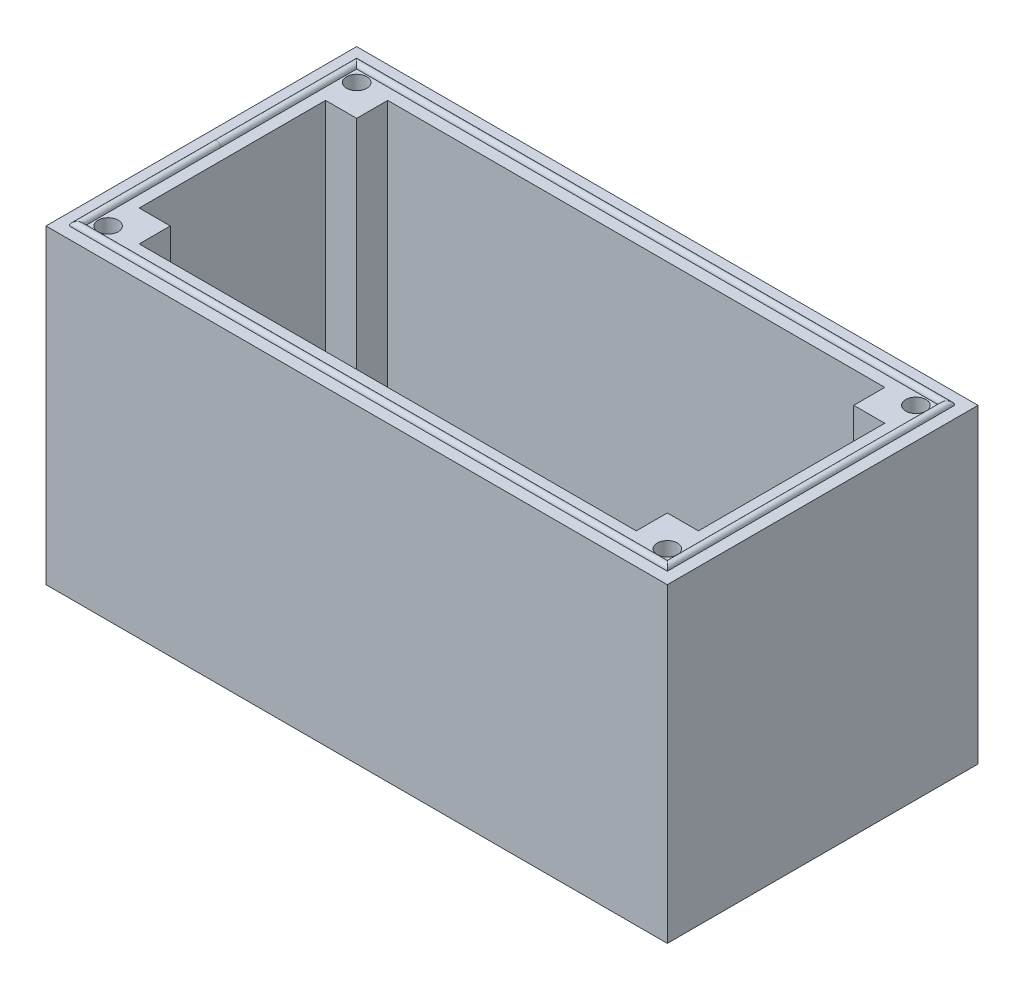
ISO-10303-21;
HEADER;
FILE_DESCRIPTION(('STEP AP214'),'2;1');
FILE_NAME('part.step','',(''),(''),'','','');
FILE_SCHEMA(('AUTOMOTIVE_DESIGN { 1 0 10303 214 1 1 1 1 }'));
ENDSEC;
DATA;
#1=APPLICATION_CONTEXT('core data for automotive mechanical design processes');
#2=APPLICATION_PROTOCOL_DEFINITION('international standard','automotive_design',2000,#1);
#3=PRODUCT_CONTEXT('',#1,'mechanical');
#4=PRODUCT('Part','Part','',(#3));
#5=PRODUCT_RELATED_PRODUCT_CATEGORY('part','',(#4));
#6=PRODUCT_DEFINITION_FORMATION('','',#4);
#7=PRODUCT_DEFINITION_CONTEXT('part definition',#1,'design');
#8=PRODUCT_DEFINITION('design','',#6,#7);
#9=PRODUCT_DEFINITION_SHAPE('','',#8);
#10=(LENGTH_UNIT() NAMED_UNIT(*) SI_UNIT(.MILLI.,.METRE.));
#11=(NAMED_UNIT(*) PLANE_ANGLE_UNIT() SI_UNIT($,.RADIAN.));
#12=(NAMED_UNIT(*) SI_UNIT($,.STERADIAN.) SOLID_ANGLE_UNIT());
#13=UNCERTAINTY_MEASURE_WITH_UNIT(LENGTH_MEASURE(1.E-05),#10,'distance_accuracy_value','');
#14=(GEOMETRIC_REPRESENTATION_CONTEXT(3) GLOBAL_UNCERTAINTY_ASSIGNED_CONTEXT((#13)) GLOBAL_UNIT_ASSIGNED_CONTEXT((#10,
#11,#12)) REPRESENTATION_CONTEXT('',''));
#15=CARTESIAN_POINT('',(0.,0.,0.));
#16=DIRECTION('',(0.,0.,1.));
#17=DIRECTION('',(1.,0.,0.));
#18=AXIS2_PLACEMENT_3D('',#15,#16,#17);
#19=CARTESIAN_POINT('',(40.,0.,-20.));
#20=DIRECTION('',(0.,-1.,0.));
#21=DIRECTION('',(0.,0.,-1.));
#22=AXIS2_PLACEMENT_3D('',#19,#20,#21);
#23=PLANE('',#22);
#24=CARTESIAN_POINT('',(2.,0.,-18.));
#25=DIRECTION('',(0.,-1.,0.));
#26=DIRECTION('',(0.,0.,-1.));
#27=AXIS2_PLACEMENT_3D('',#24,#25,#26);
#28=CIRCLE('',#27,0.675);
#29=CARTESIAN_POINT('',(2.,0.,-18.675));
#30=VERTEX_POINT('',#29);
#31=EDGE_CURVE('E852',#30,#30,#28,.T.);
#32=ORIENTED_EDGE('',*,*,#31,.F.);
#33=EDGE_LOOP('',(#32));
#34=FACE_BOUND('',#33,.T.);
#35=CARTESIAN_POINT('',(2.,0.,-2.));
#36=DIRECTION('',(0.,-1.,0.));
#37=DIRECTION('',(0.,0.,-1.));
#38=AXIS2_PLACEMENT_3D('',#35,#36,#37);
#39=CIRCLE('',#38,0.675);
#40=CARTESIAN_POINT('',(2.,0.,-2.675));
#41=VERTEX_POINT('',#40);
#42=EDGE_CURVE('E504',#41,#41,#39,.T.);
#43=ORIENTED_EDGE('',*,*,#42,.F.);
#44=EDGE_LOOP('',(#43));
#45=FACE_BOUND('',#44,.T.);
#46=CARTESIAN_POINT('',(38.,0.,-2.));
#47=DIRECTION('',(0.,-1.,0.));
#48=DIRECTION('',(0.,0.,-1.));
#49=AXIS2_PLACEMENT_3D('',#46,#47,#48);
#50=CIRCLE('',#49,0.675000000000002);
#51=CARTESIAN_POINT('',(38.,0.,-2.675));
#52=VERTEX_POINT('',#51);
#53=EDGE_CURVE('E495',#52,#52,#50,.T.);
#54=ORIENTED_EDGE('',*,*,#53,.F.);
#55=EDGE_LOOP('',(#54));
#56=FACE_BOUND('',#55,.T.);
#57=CARTESIAN_POINT('',(38.,0.,-18.));
#58=DIRECTION('',(0.,-1.,0.));
#59=DIRECTION('',(0.,0.,-1.));
#60=AXIS2_PLACEMENT_3D('',#57,#58,#59);
#61=CIRCLE('',#60,0.675000000000002);
#62=CARTESIAN_POINT('',(38.,0.,-18.675));
#63=VERTEX_POINT('',#62);
#64=EDGE_CURVE('E490',#63,#63,#61,.T.);
#65=ORIENTED_EDGE('',*,*,#64,.F.);
#66=EDGE_LOOP('',(#65));
#67=FACE_BOUND('',#66,.T.);
#68=DIRECTION('',(-1.,0.,0.));
#69=VECTOR('',#68,1.);
#70=CARTESIAN_POINT('',(39.375,0.,-18.75));
#71=LINE('',#70,#69);
#72=CARTESIAN_POINT('',(38.75,0.,-18.75));
#73=VERTEX_POINT('',#72);
#74=CARTESIAN_POINT('',(1.25000000000001,0.,-18.75));
#75=VERTEX_POINT('',#74);
#76=EDGE_CURVE('E253',#73,#75,#71,.T.);
#77=ORIENTED_EDGE('',*,*,#76,.F.);
#78=DIRECTION('',(0.,0.,-1.));
#79=VECTOR('',#78,1.);
#80=CARTESIAN_POINT('',(38.75,0.,-0.625000000000001));
#81=LINE('',#80,#79);
#82=CARTESIAN_POINT('',(38.75,0.,-1.25));
#83=VERTEX_POINT('',#82);
#84=EDGE_CURVE('E528',#83,#73,#81,.T.);
#85=ORIENTED_EDGE('',*,*,#84,.F.);
#86=DIRECTION('',(1.,0.,0.));
#87=VECTOR('',#86,1.);
#88=CARTESIAN_POINT('',(0.625000000000002,0.,-1.25));
#89=LINE('',#88,#87);
#90=CARTESIAN_POINT('',(1.25,0.,-1.25));
#91=VERTEX_POINT('',#90);
#92=EDGE_CURVE('E233',#91,#83,#89,.T.);
#93=ORIENTED_EDGE('',*,*,#92,.F.);
#94=DIRECTION('',(0.,0.,1.));
#95=VECTOR('',#94,1.);
#96=CARTESIAN_POINT('',(1.25,0.,-10.));
#97=LINE('',#96,#95);
#98=CARTESIAN_POINT('',(1.25,0.,-10.));
#99=VERTEX_POINT('',#98);
#100=EDGE_CURVE('E60',#99,#91,#97,.T.);
#101=ORIENTED_EDGE('',*,*,#100,.F.);
#102=DIRECTION('',(0.,0.,1.));
#103=VECTOR('',#102,1.);
#104=CARTESIAN_POINT('',(1.25,0.,-19.375));
#105=LINE('',#104,#103);
#106=EDGE_CURVE('E258',#75,#99,#105,.T.);
#107=ORIENTED_EDGE('',*,*,#106,.F.);
#108=EDGE_LOOP('',(#77,#85,#93,#101,#107));
#109=FACE_BOUND('',#108,.T.);
#110=DIRECTION('',(0.,0.,1.));
#111=VECTOR('',#110,1.);
#112=CARTESIAN_POINT('',(36.,0.,-3.99999999999999));
#113=LINE('',#112,#111);
#114=CARTESIAN_POINT('',(36.,0.,-3.99999999999999));
#115=VERTEX_POINT('',#114);
#116=CARTESIAN_POINT('',(36.,0.,-2.));
#117=VERTEX_POINT('',#116);
#118=EDGE_CURVE('E318',#115,#117,#113,.T.);
#119=ORIENTED_EDGE('',*,*,#118,.F.);
#120=DIRECTION('',(-1.,0.,0.));
#121=VECTOR('',#120,1.);
#122=CARTESIAN_POINT('',(38.,0.,-4.));
#123=LINE('',#122,#121);
#124=CARTESIAN_POINT('',(38.,0.,-4.));
#125=VERTEX_POINT('',#124);
#126=EDGE_CURVE('E315',#125,#115,#123,.T.);
#127=ORIENTED_EDGE('',*,*,#126,.F.);
#128=DIRECTION('',(0.,0.,-1.));
#129=VECTOR('',#128,1.);
#130=CARTESIAN_POINT('',(38.,0.,-4.));
#131=LINE('',#130,#129);
#132=CARTESIAN_POINT('',(38.,0.,-16.));
#133=VERTEX_POINT('',#132);
#134=EDGE_CURVE('E355',#125,#133,#131,.T.);
#135=ORIENTED_EDGE('',*,*,#134,.T.);
#136=DIRECTION('',(1.,0.,0.));
#137=VECTOR('',#136,1.);
#138=CARTESIAN_POINT('',(36.,0.,-16.));
#139=LINE('',#138,#137);
#140=CARTESIAN_POINT('',(36.,0.,-16.));
#141=VERTEX_POINT('',#140);
#142=EDGE_CURVE('E351',#141,#133,#139,.T.);
#143=ORIENTED_EDGE('',*,*,#142,.F.);
#144=DIRECTION('',(0.,0.,1.));
#145=VECTOR('',#144,1.);
#146=CARTESIAN_POINT('',(36.,0.,-18.));
#147=LINE('',#146,#145);
#148=CARTESIAN_POINT('',(36.,0.,-18.));
#149=VERTEX_POINT('',#148);
#150=EDGE_CURVE('E348',#149,#141,#147,.T.);
#151=ORIENTED_EDGE('',*,*,#150,.F.);
#152=DIRECTION('',(-1.,0.,0.));
#153=VECTOR('',#152,1.);
#154=CARTESIAN_POINT('',(36.,0.,-18.));
#155=LINE('',#154,#153);
#156=CARTESIAN_POINT('',(3.99999999999999,0.,-18.));
#157=VERTEX_POINT('',#156);
#158=EDGE_CURVE('E344',#149,#157,#155,.T.);
#159=ORIENTED_EDGE('',*,*,#158,.T.);
#160=DIRECTION('',(0.,0.,1.));
#161=VECTOR('',#160,1.);
#162=CARTESIAN_POINT('',(3.99999999999999,0.,-18.));
#163=LINE('',#162,#161);
#164=CARTESIAN_POINT('',(3.99999999999999,0.,-16.));
#165=VERTEX_POINT('',#164);
#166=EDGE_CURVE('E340',#157,#165,#163,.T.);
#167=ORIENTED_EDGE('',*,*,#166,.T.);
#168=DIRECTION('',(-1.,0.,0.));
#169=VECTOR('',#168,1.);
#170=CARTESIAN_POINT('',(3.99999999999999,0.,-16.));
#171=LINE('',#170,#169);
#172=CARTESIAN_POINT('',(2.,0.,-16.));
#173=VERTEX_POINT('',#172);
#174=EDGE_CURVE('E336',#165,#173,#171,.T.);
#175=ORIENTED_EDGE('',*,*,#174,.T.);
#176=DIRECTION('',(0.,0.,-1.));
#177=VECTOR('',#176,1.);
#178=CARTESIAN_POINT('',(2.,0.,-3.99999999999999));
#179=LINE('',#178,#177);
#180=CARTESIAN_POINT('',(2.,0.,-3.99999999999999));
#181=VERTEX_POINT('',#180);
#182=EDGE_CURVE('E333',#181,#173,#179,.T.);
#183=ORIENTED_EDGE('',*,*,#182,.F.);
#184=DIRECTION('',(1.,0.,0.));
#185=VECTOR('',#184,1.);
#186=CARTESIAN_POINT('',(2.,0.,-3.99999999999999));
#187=LINE('',#186,#185);
#188=CARTESIAN_POINT('',(3.99999999999999,0.,-3.99999999999999));
#189=VERTEX_POINT('',#188);
#190=EDGE_CURVE('E329',#181,#189,#187,.T.);
#191=ORIENTED_EDGE('',*,*,#190,.T.);
#192=DIRECTION('',(0.,0.,1.));
#193=VECTOR('',#192,1.);
#194=CARTESIAN_POINT('',(3.99999999999999,0.,-3.99999999999999));
#195=LINE('',#194,#193);
#196=CARTESIAN_POINT('',(3.99999999999999,0.,-2.));
#197=VERTEX_POINT('',#196);
#198=EDGE_CURVE('E325',#189,#197,#195,.T.);
#199=ORIENTED_EDGE('',*,*,#198,.T.);
#200=DIRECTION('',(-1.,0.,0.));
#201=VECTOR('',#200,1.);
#202=CARTESIAN_POINT('',(36.,0.,-2.));
#203=LINE('',#202,#201);
#204=EDGE_CURVE('E322',#117,#197,#203,.T.);
#205=ORIENTED_EDGE('',*,*,#204,.F.);
#206=EDGE_LOOP('',(#119,#127,#135,#143,#151,#159,#167,#175,#183,#191,#199,#205));
#207=FACE_BOUND('',#206,.T.);
#208=ADVANCED_FACE('F42',(#34,#45,#56,#67,#109,#207),#23,.T.);
#209=CARTESIAN_POINT('',(0.,20.,-20.));
#210=DIRECTION('',(0.,1.,0.));
#211=DIRECTION('',(0.,0.,1.));
#212=AXIS2_PLACEMENT_3D('',#209,#210,#211);
#213=PLANE('',#212);
#214=CARTESIAN_POINT('',(2.,20.,-18.));
#215=DIRECTION('',(0.,1.,0.));
#216=DIRECTION('',(0.,0.,1.));
#217=AXIS2_PLACEMENT_3D('',#214,#215,#216);
#218=CIRCLE('',#217,0.649999999999992);
#219=CARTESIAN_POINT('',(2.,20.,-17.35));
#220=VERTEX_POINT('',#219);
#221=EDGE_CURVE('E46',#220,#220,#218,.T.);
#222=ORIENTED_EDGE('',*,*,#221,.F.);
#223=EDGE_LOOP('',(#222));
#224=FACE_BOUND('',#223,.T.);
#225=CARTESIAN_POINT('',(2.,20.,-2.));
#226=DIRECTION('',(0.,1.,0.));
#227=DIRECTION('',(0.,0.,1.));
#228=AXIS2_PLACEMENT_3D('',#225,#226,#227);
#229=CIRCLE('',#228,0.649999999999992);
#230=CARTESIAN_POINT('',(2.,20.,-1.35000000000001));
#231=VERTEX_POINT('',#230);
#232=EDGE_CURVE('E492',#231,#231,#229,.T.);
#233=ORIENTED_EDGE('',*,*,#232,.F.);
#234=EDGE_LOOP('',(#233));
#235=FACE_BOUND('',#234,.T.);
#236=CARTESIAN_POINT('',(38.,20.,-2.));
#237=DIRECTION('',(0.,1.,0.));
#238=DIRECTION('',(0.,0.,1.));
#239=AXIS2_PLACEMENT_3D('',#236,#237,#238);
#240=CIRCLE('',#239,0.649999999999994);
#241=CARTESIAN_POINT('',(38.,20.,-1.35));
#242=VERTEX_POINT('',#241);
#243=EDGE_CURVE('E487',#242,#242,#240,.T.);
#244=ORIENTED_EDGE('',*,*,#243,.F.);
#245=EDGE_LOOP('',(#244));
#246=FACE_BOUND('',#245,.T.);
#247=CARTESIAN_POINT('',(38.,20.,-18.));
#248=DIRECTION('',(0.,1.,0.));
#249=DIRECTION('',(0.,0.,1.));
#250=AXIS2_PLACEMENT_3D('',#247,#248,#249);
#251=CIRCLE('',#250,0.649999999999994);
#252=CARTESIAN_POINT('',(38.,20.,-17.35));
#253=VERTEX_POINT('',#252);
#254=EDGE_CURVE('E254',#253,#253,#251,.T.);
#255=ORIENTED_EDGE('',*,*,#254,.F.);
#256=EDGE_LOOP('',(#255));
#257=FACE_BOUND('',#256,.T.);
#258=DIRECTION('',(0.,0.,-1.));
#259=VECTOR('',#258,1.);
#260=CARTESIAN_POINT('',(38.,20.,-4.));
#261=LINE('',#260,#259);
#262=CARTESIAN_POINT('',(38.,20.,-4.));
#263=VERTEX_POINT('',#262);
#264=CARTESIAN_POINT('',(38.,20.,-16.));
#265=VERTEX_POINT('',#264);
#266=EDGE_CURVE('E319',#263,#265,#261,.T.);
#267=ORIENTED_EDGE('',*,*,#266,.F.);
#268=DIRECTION('',(-1.,0.,0.));
#269=VECTOR('',#268,1.);
#270=CARTESIAN_POINT('',(38.,20.,-4.));
#271=LINE('',#270,#269);
#272=CARTESIAN_POINT('',(36.,20.,-3.99999999999999));
#273=VERTEX_POINT('',#272);
#274=EDGE_CURVE('E275',#263,#273,#271,.T.);
#275=ORIENTED_EDGE('',*,*,#274,.T.);
#276=DIRECTION('',(0.,0.,1.));
#277=VECTOR('',#276,1.);
#278=CARTESIAN_POINT('',(36.,20.,-3.99999999999999));
#279=LINE('',#278,#277);
#280=CARTESIAN_POINT('',(36.,20.,-2.));
#281=VERTEX_POINT('',#280);
#282=EDGE_CURVE('E363',#273,#281,#279,.T.);
#283=ORIENTED_EDGE('',*,*,#282,.T.);
#284=DIRECTION('',(-1.,0.,0.));
#285=VECTOR('',#284,1.);
#286=CARTESIAN_POINT('',(36.,20.,-2.));
#287=LINE('',#286,#285);
#288=CARTESIAN_POINT('',(3.99999999999999,20.,-2.));
#289=VERTEX_POINT('',#288);
#290=EDGE_CURVE('E367',#281,#289,#287,.T.);
#291=ORIENTED_EDGE('',*,*,#290,.T.);
#292=DIRECTION('',(0.,0.,1.));
#293=VECTOR('',#292,1.);
#294=CARTESIAN_POINT('',(3.99999999999999,20.,-3.99999999999999));
#295=LINE('',#294,#293);
#296=CARTESIAN_POINT('',(3.99999999999999,20.,-3.99999999999999));
#297=VERTEX_POINT('',#296);
#298=EDGE_CURVE('E371',#297,#289,#295,.T.);
#299=ORIENTED_EDGE('',*,*,#298,.F.);
#300=DIRECTION('',(1.,0.,0.));
#301=VECTOR('',#300,1.);
#302=CARTESIAN_POINT('',(2.,20.,-3.99999999999999));
#303=LINE('',#302,#301);
#304=CARTESIAN_POINT('',(2.,20.,-3.99999999999999));
#305=VERTEX_POINT('',#304);
#306=EDGE_CURVE('E375',#305,#297,#303,.T.);
#307=ORIENTED_EDGE('',*,*,#306,.F.);
#308=DIRECTION('',(0.,0.,-1.));
#309=VECTOR('',#308,1.);
#310=CARTESIAN_POINT('',(2.,20.,-3.99999999999999));
#311=LINE('',#310,#309);
#312=CARTESIAN_POINT('',(2.,20.,-16.));
#313=VERTEX_POINT('',#312);
#314=EDGE_CURVE('E379',#305,#313,#311,.T.);
#315=ORIENTED_EDGE('',*,*,#314,.T.);
#316=DIRECTION('',(-1.,0.,0.));
#317=VECTOR('',#316,1.);
#318=CARTESIAN_POINT('',(3.99999999999999,20.,-16.));
#319=LINE('',#318,#317);
#320=CARTESIAN_POINT('',(3.99999999999999,20.,-16.));
#321=VERTEX_POINT('',#320);
#322=EDGE_CURVE('E383',#321,#313,#319,.T.);
#323=ORIENTED_EDGE('',*,*,#322,.F.);
#324=DIRECTION('',(0.,0.,1.));
#325=VECTOR('',#324,1.);
#326=CARTESIAN_POINT('',(3.99999999999999,20.,-18.));
#327=LINE('',#326,#325);
#328=CARTESIAN_POINT('',(3.99999999999999,20.,-18.));
#329=VERTEX_POINT('',#328);
#330=EDGE_CURVE('E387',#329,#321,#327,.T.);
#331=ORIENTED_EDGE('',*,*,#330,.F.);
#332=DIRECTION('',(-1.,0.,0.));
#333=VECTOR('',#332,1.);
#334=CARTESIAN_POINT('',(36.,20.,-18.));
#335=LINE('',#334,#333);
#336=CARTESIAN_POINT('',(36.,20.,-18.));
#337=VERTEX_POINT('',#336);
#338=EDGE_CURVE('E391',#337,#329,#335,.T.);
#339=ORIENTED_EDGE('',*,*,#338,.F.);
#340=DIRECTION('',(0.,0.,1.));
#341=VECTOR('',#340,1.);
#342=CARTESIAN_POINT('',(36.,20.,-18.));
#343=LINE('',#342,#341);
#344=CARTESIAN_POINT('',(36.,20.,-16.));
#345=VERTEX_POINT('',#344);
#346=EDGE_CURVE('E395',#337,#345,#343,.T.);
#347=ORIENTED_EDGE('',*,*,#346,.T.);
#348=DIRECTION('',(1.,0.,0.));
#349=VECTOR('',#348,1.);
#350=CARTESIAN_POINT('',(36.,20.,-16.));
#351=LINE('',#350,#349);
#352=EDGE_CURVE('E399',#345,#265,#351,.T.);
#353=ORIENTED_EDGE('',*,*,#352,.T.);
#354=EDGE_LOOP('',(#267,#275,#283,#291,#299,#307,#315,#323,#331,#339,#347,#353));
#355=FACE_BOUND('',#354,.T.);
#356=DIRECTION('',(0.,0.,-1.));
#357=VECTOR('',#356,1.);
#358=CARTESIAN_POINT('',(1.24999999999999,20.,-0.624999999999994));
#359=LINE('',#358,#357);
#360=CARTESIAN_POINT('',(1.24999999999999,20.,-1.24999999999999));
#361=VERTEX_POINT('',#360);
#362=CARTESIAN_POINT('',(1.24999999999999,20.,-10.));
#363=VERTEX_POINT('',#362);
#364=EDGE_CURVE('E287',#361,#363,#359,.T.);
#365=ORIENTED_EDGE('',*,*,#364,.F.);
#366=DIRECTION('',(-1.,0.,0.));
#367=VECTOR('',#366,1.);
#368=CARTESIAN_POINT('',(39.375,20.,-1.24999999999999));
#369=LINE('',#368,#367);
#370=CARTESIAN_POINT('',(38.75,20.,-1.24999999999999));
#371=VERTEX_POINT('',#370);
#372=EDGE_CURVE('E291',#371,#361,#369,.T.);
#373=ORIENTED_EDGE('',*,*,#372,.F.);
#374=DIRECTION('',(0.,0.,1.));
#375=VECTOR('',#374,1.);
#376=CARTESIAN_POINT('',(38.75,20.,-19.375));
#377=LINE('',#376,#375);
#378=CARTESIAN_POINT('',(38.75,20.,-18.75));
#379=VERTEX_POINT('',#378);
#380=EDGE_CURVE('E280',#379,#371,#377,.T.);
#381=ORIENTED_EDGE('',*,*,#380,.F.);
#382=DIRECTION('',(1.,0.,0.));
#383=VECTOR('',#382,1.);
#384=CARTESIAN_POINT('',(0.624999999999994,20.,-18.75));
#385=LINE('',#384,#383);
#386=CARTESIAN_POINT('',(1.25,20.,-18.75));
#387=VERTEX_POINT('',#386);
#388=EDGE_CURVE('E271',#387,#379,#385,.T.);
#389=ORIENTED_EDGE('',*,*,#388,.F.);
#390=DIRECTION('',(0.,0.,-1.));
#391=VECTOR('',#390,1.);
#392=CARTESIAN_POINT('',(1.24999999999999,20.,-10.));
#393=LINE('',#392,#391);
#394=EDGE_CURVE('E302',#363,#387,#393,.T.);
#395=ORIENTED_EDGE('',*,*,#394,.F.);
#396=EDGE_LOOP('',(#365,#373,#381,#389,#395));
#397=FACE_BOUND('',#396,.T.);
#398=ADVANCED_FACE('F568',(#224,#235,#246,#257,#355,#397),#213,.T.);
#399=DIRECTION('',(-1.,0.,0.));
#400=VECTOR('',#399,1.);
#401=CARTESIAN_POINT('',(0.,20.,0.));
#402=LINE('',#401,#400);
#403=CARTESIAN_POINT('',(40.,20.,0.));
#404=VERTEX_POINT('',#403);
#405=CARTESIAN_POINT('',(0.,20.,0.));
#406=VERTEX_POINT('',#405);
#407=EDGE_CURVE('E469',#404,#406,#402,.T.);
#408=ORIENTED_EDGE('',*,*,#407,.F.);
#409=DIRECTION('',(0.,0.,1.));
#410=VECTOR('',#409,1.);
#411=CARTESIAN_POINT('',(40.,20.,-20.));
#412=LINE('',#411,#410);
#413=CARTESIAN_POINT('',(40.,20.,-20.));
#414=VERTEX_POINT('',#413);
#415=EDGE_CURVE('E478',#414,#404,#412,.T.);
#416=ORIENTED_EDGE('',*,*,#415,.F.);
#417=DIRECTION('',(-1.,0.,0.));
#418=VECTOR('',#417,1.);
#419=CARTESIAN_POINT('',(0.,20.,-20.));
#420=LINE('',#419,#418);
#421=CARTESIAN_POINT('',(0.,20.,-20.));
#422=VERTEX_POINT('',#421);
#423=EDGE_CURVE('E453',#414,#422,#420,.T.);
#424=ORIENTED_EDGE('',*,*,#423,.T.);
#425=DIRECTION('',(0.,0.,1.));
#426=VECTOR('',#425,1.);
#427=CARTESIAN_POINT('',(0.,20.,-20.));
#428=LINE('',#427,#426);
#429=EDGE_CURVE('E52',#422,#406,#428,.T.);
#430=ORIENTED_EDGE('',*,*,#429,.T.);
#431=EDGE_LOOP('',(#408,#416,#424,#430));
#432=FACE_BOUND('',#431,.T.);
#433=DIRECTION('',(0.,0.,1.));
#434=VECTOR('',#433,1.);
#435=CARTESIAN_POINT('',(39.25,20.,-19.375));
#436=LINE('',#435,#434);
#437=CARTESIAN_POINT('',(39.25,20.,-19.25));
#438=VERTEX_POINT('',#437);
#439=CARTESIAN_POINT('',(39.25,20.,-0.749999999999993));
#440=VERTEX_POINT('',#439);
#441=EDGE_CURVE('E276',#438,#440,#436,.T.);
#442=ORIENTED_EDGE('',*,*,#441,.T.);
#443=DIRECTION('',(-1.,0.,0.));
#444=VECTOR('',#443,1.);
#445=CARTESIAN_POINT('',(39.375,20.,-0.749999999999993));
#446=LINE('',#445,#444);
#447=CARTESIAN_POINT('',(0.749999999999993,20.,-0.749999999999994));
#448=VERTEX_POINT('',#447);
#449=EDGE_CURVE('E308',#440,#448,#446,.T.);
#450=ORIENTED_EDGE('',*,*,#449,.T.);
#451=DIRECTION('',(0.,0.,-1.));
#452=VECTOR('',#451,1.);
#453=CARTESIAN_POINT('',(0.749999999999993,20.,-0.624999999999994));
#454=LINE('',#453,#452);
#455=CARTESIAN_POINT('',(0.749999999999993,20.,-10.));
#456=VERTEX_POINT('',#455);
#457=EDGE_CURVE('E290',#448,#456,#454,.T.);
#458=ORIENTED_EDGE('',*,*,#457,.T.);
#459=DIRECTION('',(0.,0.,-1.));
#460=VECTOR('',#459,1.);
#461=CARTESIAN_POINT('',(0.749999999999993,20.,-10.));
#462=LINE('',#461,#460);
#463=CARTESIAN_POINT('',(0.749999999999994,20.,-19.25));
#464=VERTEX_POINT('',#463);
#465=EDGE_CURVE('E298',#456,#464,#462,.T.);
#466=ORIENTED_EDGE('',*,*,#465,.T.);
#467=DIRECTION('',(1.,0.,0.));
#468=VECTOR('',#467,1.);
#469=CARTESIAN_POINT('',(0.624999999999994,20.,-19.25));
#470=LINE('',#469,#468);
#471=EDGE_CURVE('E262',#464,#438,#470,.T.);
#472=ORIENTED_EDGE('',*,*,#471,.T.);
#473=EDGE_LOOP('',(#442,#450,#458,#466,#472));
#474=FACE_BOUND('',#473,.T.);
#475=ADVANCED_FACE('F574',(#432,#474),#213,.T.);
#476=DIRECTION('',(-1.,0.,0.));
#477=VECTOR('',#476,1.);
#478=CARTESIAN_POINT('',(39.375,0.,-19.25));
#479=LINE('',#478,#477);
#480=CARTESIAN_POINT('',(39.25,0.,-19.25));
#481=VERTEX_POINT('',#480);
#482=CARTESIAN_POINT('',(0.750000000000004,0.,-19.25));
#483=VERTEX_POINT('',#482);
#484=EDGE_CURVE('E250',#481,#483,#479,.T.);
#485=ORIENTED_EDGE('',*,*,#484,.T.);
#486=DIRECTION('',(0.,0.,1.));
#487=VECTOR('',#486,1.);
#488=CARTESIAN_POINT('',(0.750000000000001,0.,-19.375));
#489=LINE('',#488,#487);
#490=CARTESIAN_POINT('',(0.750000000000001,0.,-10.));
#491=VERTEX_POINT('',#490);
#492=EDGE_CURVE('E239',#483,#491,#489,.T.);
#493=ORIENTED_EDGE('',*,*,#492,.T.);
#494=DIRECTION('',(0.,0.,1.));
#495=VECTOR('',#494,1.);
#496=CARTESIAN_POINT('',(0.750000000000001,0.,-10.));
#497=LINE('',#496,#495);
#498=CARTESIAN_POINT('',(0.750000000000001,0.,-0.750000000000002));
#499=VERTEX_POINT('',#498);
#500=EDGE_CURVE('E219',#491,#499,#497,.T.);
#501=ORIENTED_EDGE('',*,*,#500,.T.);
#502=DIRECTION('',(1.,0.,0.));
#503=VECTOR('',#502,1.);
#504=CARTESIAN_POINT('',(0.625000000000002,0.,-0.750000000000002));
#505=LINE('',#504,#503);
#506=CARTESIAN_POINT('',(39.25,0.,-0.750000000000001));
#507=VERTEX_POINT('',#506);
#508=EDGE_CURVE('E229',#499,#507,#505,.T.);
#509=ORIENTED_EDGE('',*,*,#508,.T.);
#510=DIRECTION('',(0.,0.,-1.));
#511=VECTOR('',#510,1.);
#512=CARTESIAN_POINT('',(39.25,0.,-0.625000000000001));
#513=LINE('',#512,#511);
#514=EDGE_CURVE('E68',#507,#481,#513,.T.);
#515=ORIENTED_EDGE('',*,*,#514,.T.);
#516=EDGE_LOOP('',(#485,#493,#501,#509,#515));
#517=FACE_BOUND('',#516,.T.);
#518=DIRECTION('',(1.,0.,0.));
#519=VECTOR('',#518,1.);
#520=CARTESIAN_POINT('',(40.,0.,0.));
#521=LINE('',#520,#519);
#522=CARTESIAN_POINT('',(0.,0.,0.));
#523=VERTEX_POINT('',#522);
#524=CARTESIAN_POINT('',(40.,0.,0.));
#525=VERTEX_POINT('',#524);
#526=EDGE_CURVE('E443',#523,#525,#521,.T.);
#527=ORIENTED_EDGE('',*,*,#526,.F.);
#528=DIRECTION('',(0.,0.,1.));
#529=VECTOR('',#528,1.);
#530=CARTESIAN_POINT('',(0.,0.,-20.));
#531=LINE('',#530,#529);
#532=CARTESIAN_POINT('',(0.,0.,-20.));
#533=VERTEX_POINT('',#532);
#534=EDGE_CURVE('E11',#533,#523,#531,.T.);
#535=ORIENTED_EDGE('',*,*,#534,.F.);
#536=DIRECTION('',(1.,0.,0.));
#537=VECTOR('',#536,1.);
#538=CARTESIAN_POINT('',(40.,0.,-20.));
#539=LINE('',#538,#537);
#540=CARTESIAN_POINT('',(40.,0.,-20.));
#541=VERTEX_POINT('',#540);
#542=EDGE_CURVE('E444',#533,#541,#539,.T.);
#543=ORIENTED_EDGE('',*,*,#542,.T.);
#544=DIRECTION('',(0.,0.,1.));
#545=VECTOR('',#544,1.);
#546=CARTESIAN_POINT('',(40.,0.,-20.));
#547=LINE('',#546,#545);
#548=EDGE_CURVE('E461',#541,#525,#547,.T.);
#549=ORIENTED_EDGE('',*,*,#548,.T.);
#550=EDGE_LOOP('',(#527,#535,#543,#549));
#551=FACE_BOUND('',#550,.T.);
#552=ADVANCED_FACE('F44',(#517,#551),#23,.T.);
#553=CARTESIAN_POINT('',(0.,0.,-20.));
#554=DIRECTION('',(-1.,0.,0.));
#555=DIRECTION('',(0.,-1.,0.));
#556=AXIS2_PLACEMENT_3D('',#553,#554,#555);
#557=PLANE('',#556);
#558=DIRECTION('',(0.,-1.,0.));
#559=VECTOR('',#558,1.);
#560=CARTESIAN_POINT('',(0.,0.,0.));
#561=LINE('',#560,#559);
#562=EDGE_CURVE('E449',#406,#523,#561,.T.);
#563=ORIENTED_EDGE('',*,*,#562,.F.);
#564=ORIENTED_EDGE('',*,*,#429,.F.);
#565=DIRECTION('',(0.,-1.,0.));
#566=VECTOR('',#565,1.);
#567=CARTESIAN_POINT('',(0.,0.,-20.));
#568=LINE('',#567,#566);
#569=EDGE_CURVE('E457',#422,#533,#568,.T.);
#570=ORIENTED_EDGE('',*,*,#569,.T.);
#571=ORIENTED_EDGE('',*,*,#534,.T.);
#572=EDGE_LOOP('',(#563,#564,#570,#571));
#573=FACE_BOUND('',#572,.T.);
#574=ADVANCED_FACE('F580',(#573),#557,.T.);
#575=CARTESIAN_POINT('',(40.,20.,-20.));
#576=DIRECTION('',(1.,0.,0.));
#577=DIRECTION('',(0.,1.,0.));
#578=AXIS2_PLACEMENT_3D('',#575,#576,#577);
#579=PLANE('',#578);
#580=DIRECTION('',(0.,1.,0.));
#581=VECTOR('',#580,1.);
#582=CARTESIAN_POINT('',(40.,20.,0.));
#583=LINE('',#582,#581);
#584=EDGE_CURVE('E465',#525,#404,#583,.T.);
#585=ORIENTED_EDGE('',*,*,#584,.F.);
#586=ORIENTED_EDGE('',*,*,#548,.F.);
#587=DIRECTION('',(0.,1.,0.));
#588=VECTOR('',#587,1.);
#589=CARTESIAN_POINT('',(40.,20.,-20.));
#590=LINE('',#589,#588);
#591=EDGE_CURVE('E448',#541,#414,#590,.T.);
#592=ORIENTED_EDGE('',*,*,#591,.T.);
#593=ORIENTED_EDGE('',*,*,#415,.T.);
#594=EDGE_LOOP('',(#585,#586,#592,#593));
#595=FACE_BOUND('',#594,.T.);
#596=ADVANCED_FACE('F585',(#595),#579,.T.);
#597=CARTESIAN_POINT('',(0.,0.,-20.));
#598=DIRECTION('',(0.,0.,-1.));
#599=DIRECTION('',(-1.,0.,0.));
#600=AXIS2_PLACEMENT_3D('',#597,#598,#599);
#601=PLANE('',#600);
#602=ORIENTED_EDGE('',*,*,#542,.F.);
#603=ORIENTED_EDGE('',*,*,#569,.F.);
#604=ORIENTED_EDGE('',*,*,#423,.F.);
#605=ORIENTED_EDGE('',*,*,#591,.F.);
#606=EDGE_LOOP('',(#602,#603,#604,#605));
#607=FACE_BOUND('',#606,.T.);
#608=ADVANCED_FACE('F598',(#607),#601,.T.);
#609=CARTESIAN_POINT('',(0.,0.,0.));
#610=DIRECTION('',(0.,0.,-1.));
#611=DIRECTION('',(-1.,0.,0.));
#612=AXIS2_PLACEMENT_3D('',#609,#610,#611);
#613=PLANE('',#612);
#614=ORIENTED_EDGE('',*,*,#526,.T.);
#615=ORIENTED_EDGE('',*,*,#584,.T.);
#616=ORIENTED_EDGE('',*,*,#407,.T.);
#617=ORIENTED_EDGE('',*,*,#562,.T.);
#618=EDGE_LOOP('',(#614,#615,#616,#617));
#619=FACE_BOUND('',#618,.T.);
#620=ADVANCED_FACE('F603',(#619),#613,.F.);
#621=CARTESIAN_POINT('',(38.,0.,-4.));
#622=DIRECTION('',(0.,0.,-1.));
#623=DIRECTION('',(-1.,0.,0.));
#624=AXIS2_PLACEMENT_3D('',#621,#622,#623);
#625=PLANE('',#624);
#626=ORIENTED_EDGE('',*,*,#274,.F.);
#627=DIRECTION('',(0.,1.,0.));
#628=VECTOR('',#627,1.);
#629=CARTESIAN_POINT('',(38.,0.,-4.));
#630=LINE('',#629,#628);
#631=EDGE_CURVE('E359',#125,#263,#630,.T.);
#632=ORIENTED_EDGE('',*,*,#631,.F.);
#633=ORIENTED_EDGE('',*,*,#126,.T.);
#634=DIRECTION('',(0.,1.,0.));
#635=VECTOR('',#634,1.);
#636=CARTESIAN_POINT('',(36.,0.,-3.99999999999999));
#637=LINE('',#636,#635);
#638=EDGE_CURVE('E439',#115,#273,#637,.T.);
#639=ORIENTED_EDGE('',*,*,#638,.T.);
#640=EDGE_LOOP('',(#626,#632,#633,#639));
#641=FACE_BOUND('',#640,.T.);
#642=ADVANCED_FACE('F615',(#641),#625,.T.);
#643=CARTESIAN_POINT('',(36.,0.,-3.99999999999999));
#644=DIRECTION('',(-1.,0.,0.));
#645=DIRECTION('',(0.,0.,1.));
#646=AXIS2_PLACEMENT_3D('',#643,#644,#645);
#647=PLANE('',#646);
#648=ORIENTED_EDGE('',*,*,#282,.F.);
#649=ORIENTED_EDGE('',*,*,#638,.F.);
#650=ORIENTED_EDGE('',*,*,#118,.T.);
#651=DIRECTION('',(0.,1.,0.));
#652=VECTOR('',#651,1.);
#653=CARTESIAN_POINT('',(36.,0.,-2.));
#654=LINE('',#653,#652);
#655=EDGE_CURVE('E436',#117,#281,#654,.T.);
#656=ORIENTED_EDGE('',*,*,#655,.T.);
#657=EDGE_LOOP('',(#648,#649,#650,#656));
#658=FACE_BOUND('',#657,.T.);
#659=ADVANCED_FACE('F620',(#658),#647,.T.);
#660=CARTESIAN_POINT('',(36.,0.,-2.));
#661=DIRECTION('',(0.,0.,-1.));
#662=DIRECTION('',(-1.,0.,0.));
#663=AXIS2_PLACEMENT_3D('',#660,#661,#662);
#664=PLANE('',#663);
#665=ORIENTED_EDGE('',*,*,#290,.F.);
#666=ORIENTED_EDGE('',*,*,#655,.F.);
#667=ORIENTED_EDGE('',*,*,#204,.T.);
#668=DIRECTION('',(0.,1.,0.));
#669=VECTOR('',#668,1.);
#670=CARTESIAN_POINT('',(3.99999999999999,0.,-2.));
#671=LINE('',#670,#669);
#672=EDGE_CURVE('E433',#197,#289,#671,.T.);
#673=ORIENTED_EDGE('',*,*,#672,.T.);
#674=EDGE_LOOP('',(#665,#666,#667,#673));
#675=FACE_BOUND('',#674,.T.);
#676=ADVANCED_FACE('F626',(#675),#664,.T.);
#677=CARTESIAN_POINT('',(3.99999999999999,0.,-3.99999999999999));
#678=DIRECTION('',(-1.,0.,0.));
#679=DIRECTION('',(0.,0.,1.));
#680=AXIS2_PLACEMENT_3D('',#677,#678,#679);
#681=PLANE('',#680);
#682=ORIENTED_EDGE('',*,*,#298,.T.);
#683=ORIENTED_EDGE('',*,*,#672,.F.);
#684=ORIENTED_EDGE('',*,*,#198,.F.);
#685=DIRECTION('',(0.,1.,0.));
#686=VECTOR('',#685,1.);
#687=CARTESIAN_POINT('',(3.99999999999999,0.,-3.99999999999999));
#688=LINE('',#687,#686);
#689=EDGE_CURVE('E430',#189,#297,#688,.T.);
#690=ORIENTED_EDGE('',*,*,#689,.T.);
#691=EDGE_LOOP('',(#682,#683,#684,#690));
#692=FACE_BOUND('',#691,.T.);
#693=ADVANCED_FACE('F630',(#692),#681,.F.);
#694=CARTESIAN_POINT('',(2.,0.,-3.99999999999999));
#695=DIRECTION('',(0.,0.,1.));
#696=DIRECTION('',(1.,0.,0.));
#697=AXIS2_PLACEMENT_3D('',#694,#695,#696);
#698=PLANE('',#697);
#699=ORIENTED_EDGE('',*,*,#306,.T.);
#700=ORIENTED_EDGE('',*,*,#689,.F.);
#701=ORIENTED_EDGE('',*,*,#190,.F.);
#702=DIRECTION('',(0.,1.,0.));
#703=VECTOR('',#702,1.);
#704=CARTESIAN_POINT('',(2.,0.,-3.99999999999999));
#705=LINE('',#704,#703);
#706=EDGE_CURVE('E427',#181,#305,#705,.T.);
#707=ORIENTED_EDGE('',*,*,#706,.T.);
#708=EDGE_LOOP('',(#699,#700,#701,#707));
#709=FACE_BOUND('',#708,.T.);
#710=ADVANCED_FACE('F634',(#709),#698,.F.);
#711=CARTESIAN_POINT('',(2.,0.,-3.99999999999999));
#712=DIRECTION('',(1.,0.,0.));
#713=DIRECTION('',(0.,0.,-1.));
#714=AXIS2_PLACEMENT_3D('',#711,#712,#713);
#715=PLANE('',#714);
#716=ORIENTED_EDGE('',*,*,#314,.F.);
#717=ORIENTED_EDGE('',*,*,#706,.F.);
#718=ORIENTED_EDGE('',*,*,#182,.T.);
#719=DIRECTION('',(0.,1.,0.));
#720=VECTOR('',#719,1.);
#721=CARTESIAN_POINT('',(2.,0.,-16.));
#722=LINE('',#721,#720);
#723=EDGE_CURVE('E424',#173,#313,#722,.T.);
#724=ORIENTED_EDGE('',*,*,#723,.T.);
#725=EDGE_LOOP('',(#716,#717,#718,#724));
#726=FACE_BOUND('',#725,.T.);
#727=ADVANCED_FACE('F638',(#726),#715,.T.);
#728=CARTESIAN_POINT('',(3.99999999999999,0.,-16.));
#729=DIRECTION('',(0.,0.,-1.));
#730=DIRECTION('',(-1.,0.,0.));
#731=AXIS2_PLACEMENT_3D('',#728,#729,#730);
#732=PLANE('',#731);
#733=ORIENTED_EDGE('',*,*,#322,.T.);
#734=ORIENTED_EDGE('',*,*,#723,.F.);
#735=ORIENTED_EDGE('',*,*,#174,.F.);
#736=DIRECTION('',(0.,1.,0.));
#737=VECTOR('',#736,1.);
#738=CARTESIAN_POINT('',(3.99999999999999,0.,-16.));
#739=LINE('',#738,#737);
#740=EDGE_CURVE('E421',#165,#321,#739,.T.);
#741=ORIENTED_EDGE('',*,*,#740,.T.);
#742=EDGE_LOOP('',(#733,#734,#735,#741));
#743=FACE_BOUND('',#742,.T.);
#744=ADVANCED_FACE('F642',(#743),#732,.F.);
#745=CARTESIAN_POINT('',(3.99999999999999,0.,-18.));
#746=DIRECTION('',(-1.,0.,0.));
#747=DIRECTION('',(0.,0.,1.));
#748=AXIS2_PLACEMENT_3D('',#745,#746,#747);
#749=PLANE('',#748);
#750=ORIENTED_EDGE('',*,*,#330,.T.);
#751=ORIENTED_EDGE('',*,*,#740,.F.);
#752=ORIENTED_EDGE('',*,*,#166,.F.);
#753=DIRECTION('',(0.,1.,0.));
#754=VECTOR('',#753,1.);
#755=CARTESIAN_POINT('',(3.99999999999999,0.,-18.));
#756=LINE('',#755,#754);
#757=EDGE_CURVE('E418',#157,#329,#756,.T.);
#758=ORIENTED_EDGE('',*,*,#757,.T.);
#759=EDGE_LOOP('',(#750,#751,#752,#758));
#760=FACE_BOUND('',#759,.T.);
#761=ADVANCED_FACE('F646',(#760),#749,.F.);
#762=CARTESIAN_POINT('',(36.,0.,-18.));
#763=DIRECTION('',(0.,0.,-1.));
#764=DIRECTION('',(-1.,0.,0.));
#765=AXIS2_PLACEMENT_3D('',#762,#763,#764);
#766=PLANE('',#765);
#767=ORIENTED_EDGE('',*,*,#338,.T.);
#768=ORIENTED_EDGE('',*,*,#757,.F.);
#769=ORIENTED_EDGE('',*,*,#158,.F.);
#770=DIRECTION('',(0.,1.,0.));
#771=VECTOR('',#770,1.);
#772=CARTESIAN_POINT('',(36.,0.,-18.));
#773=LINE('',#772,#771);
#774=EDGE_CURVE('E415',#149,#337,#773,.T.);
#775=ORIENTED_EDGE('',*,*,#774,.T.);
#776=EDGE_LOOP('',(#767,#768,#769,#775));
#777=FACE_BOUND('',#776,.T.);
#778=ADVANCED_FACE('F650',(#777),#766,.F.);
#779=CARTESIAN_POINT('',(36.,0.,-18.));
#780=DIRECTION('',(-1.,0.,0.));
#781=DIRECTION('',(0.,0.,1.));
#782=AXIS2_PLACEMENT_3D('',#779,#780,#781);
#783=PLANE('',#782);
#784=ORIENTED_EDGE('',*,*,#346,.F.);
#785=ORIENTED_EDGE('',*,*,#774,.F.);
#786=ORIENTED_EDGE('',*,*,#150,.T.);
#787=DIRECTION('',(0.,1.,0.));
#788=VECTOR('',#787,1.);
#789=CARTESIAN_POINT('',(36.,0.,-16.));
#790=LINE('',#789,#788);
#791=EDGE_CURVE('E412',#141,#345,#790,.T.);
#792=ORIENTED_EDGE('',*,*,#791,.T.);
#793=EDGE_LOOP('',(#784,#785,#786,#792));
#794=FACE_BOUND('',#793,.T.);
#795=ADVANCED_FACE('F654',(#794),#783,.T.);
#796=CARTESIAN_POINT('',(36.,0.,-16.));
#797=DIRECTION('',(0.,0.,1.));
#798=DIRECTION('',(1.,0.,0.));
#799=AXIS2_PLACEMENT_3D('',#796,#797,#798);
#800=PLANE('',#799);
#801=ORIENTED_EDGE('',*,*,#352,.F.);
#802=ORIENTED_EDGE('',*,*,#791,.F.);
#803=ORIENTED_EDGE('',*,*,#142,.T.);
#804=DIRECTION('',(0.,1.,0.));
#805=VECTOR('',#804,1.);
#806=CARTESIAN_POINT('',(38.,0.,-16.));
#807=LINE('',#806,#805);
#808=EDGE_CURVE('E409',#133,#265,#807,.T.);
#809=ORIENTED_EDGE('',*,*,#808,.T.);
#810=EDGE_LOOP('',(#801,#802,#803,#809));
#811=FACE_BOUND('',#810,.T.);
#812=ADVANCED_FACE('F658',(#811),#800,.T.);
#813=CARTESIAN_POINT('',(38.,0.,-4.));
#814=DIRECTION('',(1.,0.,0.));
#815=DIRECTION('',(0.,0.,-1.));
#816=AXIS2_PLACEMENT_3D('',#813,#814,#815);
#817=PLANE('',#816);
#818=ORIENTED_EDGE('',*,*,#266,.T.);
#819=ORIENTED_EDGE('',*,*,#808,.F.);
#820=ORIENTED_EDGE('',*,*,#134,.F.);
#821=ORIENTED_EDGE('',*,*,#631,.T.);
#822=EDGE_LOOP('',(#818,#819,#820,#821));
#823=FACE_BOUND('',#822,.T.);
#824=ADVANCED_FACE('F561',(#823),#817,.F.);
#825=CARTESIAN_POINT('',(39.375,20.,-0.999999999999993));
#826=DIRECTION('',(-1.,0.,0.));
#827=DIRECTION('',(0.,0.,1.));
#828=AXIS2_PLACEMENT_3D('',#825,#826,#827);
#829=CYLINDRICAL_SURFACE('',#828,0.25);
#830=ORIENTED_EDGE('',*,*,#449,.F.);
#831=CARTESIAN_POINT('',(39.,20.,-0.999999999999994));
#832=DIRECTION('',(-0.707106781186548,0.,0.707106781186548));
#833=DIRECTION('',(0.707106781186548,0.,0.707106781186548));
#834=AXIS2_PLACEMENT_3D('',#831,#832,#833);
#835=ELLIPSE('',#834,0.353553390593274,0.25);
#836=EDGE_CURVE('E267',#440,#371,#835,.T.);
#837=ORIENTED_EDGE('',*,*,#836,.T.);
#838=ORIENTED_EDGE('',*,*,#372,.T.);
#839=CARTESIAN_POINT('',(0.999999999999993,20.,-0.999999999999994));
#840=DIRECTION('',(-0.707106781186547,0.,-0.707106781186547));
#841=DIRECTION('',(0.707106781186548,0.,-0.707106781186548));
#842=AXIS2_PLACEMENT_3D('',#839,#840,#841);
#843=ELLIPSE('',#842,0.353553390593274,0.25);
#844=EDGE_CURVE('E281',#448,#361,#843,.T.);
#845=ORIENTED_EDGE('',*,*,#844,.F.);
#846=EDGE_LOOP('',(#830,#837,#838,#845));
#847=FACE_BOUND('',#846,.T.);
#848=ADVANCED_FACE('F665',(#847),#829,.T.);
#849=CARTESIAN_POINT('',(0.999999999999993,20.,-0.624999999999994));
#850=DIRECTION('',(0.,0.,-1.));
#851=DIRECTION('',(-1.,0.,0.));
#852=AXIS2_PLACEMENT_3D('',#849,#850,#851);
#853=CYLINDRICAL_SURFACE('',#852,0.25);
#854=ORIENTED_EDGE('',*,*,#844,.T.);
#855=ORIENTED_EDGE('',*,*,#364,.T.);
#856=CARTESIAN_POINT('',(0.999999999999993,20.,-10.));
#857=DIRECTION('',(0.,0.,1.));
#858=DIRECTION('',(1.,0.,0.));
#859=AXIS2_PLACEMENT_3D('',#856,#857,#858);
#860=CIRCLE('',#859,0.25);
#861=EDGE_CURVE('E295',#363,#456,#860,.T.);
#862=ORIENTED_EDGE('',*,*,#861,.T.);
#863=ORIENTED_EDGE('',*,*,#457,.F.);
#864=EDGE_LOOP('',(#854,#855,#862,#863));
#865=FACE_BOUND('',#864,.T.);
#866=ADVANCED_FACE('F669',(#865),#853,.T.);
#867=CARTESIAN_POINT('',(0.999999999999993,20.,-10.));
#868=DIRECTION('',(0.,0.,-1.));
#869=DIRECTION('',(-1.,0.,0.));
#870=AXIS2_PLACEMENT_3D('',#867,#868,#869);
#871=CYLINDRICAL_SURFACE('',#870,0.25);
#872=ORIENTED_EDGE('',*,*,#465,.F.);
#873=ORIENTED_EDGE('',*,*,#861,.F.);
#874=ORIENTED_EDGE('',*,*,#394,.T.);
#875=CARTESIAN_POINT('',(0.999999999999997,20.,-19.));
#876=DIRECTION('',(0.707106781186548,0.,-0.707106781186548));
#877=DIRECTION('',(0.707106781186548,0.,0.707106781186548));
#878=AXIS2_PLACEMENT_3D('',#875,#876,#877);
#879=ELLIPSE('',#878,0.353553390593274,0.25);
#880=EDGE_CURVE('E263',#464,#387,#879,.T.);
#881=ORIENTED_EDGE('',*,*,#880,.F.);
#882=EDGE_LOOP('',(#872,#873,#874,#881));
#883=FACE_BOUND('',#882,.T.);
#884=ADVANCED_FACE('F671',(#883),#871,.T.);
#885=CARTESIAN_POINT('',(39.,20.,-19.375));
#886=DIRECTION('',(0.,0.,1.));
#887=DIRECTION('',(1.,0.,0.));
#888=AXIS2_PLACEMENT_3D('',#885,#886,#887);
#889=CYLINDRICAL_SURFACE('',#888,0.25);
#890=ORIENTED_EDGE('',*,*,#441,.F.);
#891=CARTESIAN_POINT('',(39.,20.,-19.));
#892=DIRECTION('',(0.707106781186548,0.,0.707106781186547));
#893=DIRECTION('',(0.707106781186547,0.,-0.707106781186548));
#894=AXIS2_PLACEMENT_3D('',#891,#892,#893);
#895=ELLIPSE('',#894,0.353553390593274,0.25);
#896=EDGE_CURVE('E259',#438,#379,#895,.T.);
#897=ORIENTED_EDGE('',*,*,#896,.T.);
#898=ORIENTED_EDGE('',*,*,#380,.T.);
#899=ORIENTED_EDGE('',*,*,#836,.F.);
#900=EDGE_LOOP('',(#890,#897,#898,#899));
#901=FACE_BOUND('',#900,.T.);
#902=ADVANCED_FACE('F558',(#901),#889,.T.);
#903=CARTESIAN_POINT('',(0.624999999999994,20.,-19.));
#904=DIRECTION('',(1.,0.,0.));
#905=DIRECTION('',(0.,0.,-1.));
#906=AXIS2_PLACEMENT_3D('',#903,#904,#905);
#907=CYLINDRICAL_SURFACE('',#906,0.25);
#908=ORIENTED_EDGE('',*,*,#880,.T.);
#909=ORIENTED_EDGE('',*,*,#388,.T.);
#910=ORIENTED_EDGE('',*,*,#896,.F.);
#911=ORIENTED_EDGE('',*,*,#471,.F.);
#912=EDGE_LOOP('',(#908,#909,#910,#911));
#913=FACE_BOUND('',#912,.T.);
#914=ADVANCED_FACE('F550',(#913),#907,.T.);
#915=CARTESIAN_POINT('',(39.375,0.,-19.));
#916=DIRECTION('',(-1.,0.,0.));
#917=DIRECTION('',(0.,0.,1.));
#918=AXIS2_PLACEMENT_3D('',#915,#916,#917);
#919=CYLINDRICAL_SURFACE('',#918,0.25);
#920=ORIENTED_EDGE('',*,*,#484,.F.);
#921=CARTESIAN_POINT('',(39.,0.,-19.));
#922=DIRECTION('',(-0.707106781186548,0.,-0.707106781186547));
#923=DIRECTION('',(0.707106781186547,0.,-0.707106781186548));
#924=AXIS2_PLACEMENT_3D('',#921,#922,#923);
#925=ELLIPSE('',#924,0.353553390593274,0.25);
#926=EDGE_CURVE('E226',#481,#73,#925,.F.);
#927=ORIENTED_EDGE('',*,*,#926,.T.);
#928=ORIENTED_EDGE('',*,*,#76,.T.);
#929=CARTESIAN_POINT('',(1.,0.,-19.));
#930=DIRECTION('',(-0.707106781186547,0.,0.707106781186547));
#931=DIRECTION('',(0.707106781186548,0.,0.707106781186548));
#932=AXIS2_PLACEMENT_3D('',#929,#930,#931);
#933=ELLIPSE('',#932,0.353553390593274,0.25);
#934=EDGE_CURVE('E241',#483,#75,#933,.F.);
#935=ORIENTED_EDGE('',*,*,#934,.F.);
#936=EDGE_LOOP('',(#920,#927,#928,#935));
#937=FACE_BOUND('',#936,.T.);
#938=ADVANCED_FACE('F548',(#937),#919,.F.);
#939=CARTESIAN_POINT('',(1.,0.,-19.375));
#940=DIRECTION('',(0.,0.,1.));
#941=DIRECTION('',(1.,0.,0.));
#942=AXIS2_PLACEMENT_3D('',#939,#940,#941);
#943=CYLINDRICAL_SURFACE('',#942,0.25);
#944=ORIENTED_EDGE('',*,*,#934,.T.);
#945=ORIENTED_EDGE('',*,*,#106,.T.);
#946=CARTESIAN_POINT('',(1.,0.,-10.));
#947=DIRECTION('',(0.,0.,1.));
#948=DIRECTION('',(1.,0.,0.));
#949=AXIS2_PLACEMENT_3D('',#946,#947,#948);
#950=CIRCLE('',#949,0.25);
#951=EDGE_CURVE('E246',#99,#491,#950,.T.);
#952=ORIENTED_EDGE('',*,*,#951,.T.);
#953=ORIENTED_EDGE('',*,*,#492,.F.);
#954=EDGE_LOOP('',(#944,#945,#952,#953));
#955=FACE_BOUND('',#954,.T.);
#956=ADVANCED_FACE('F539',(#955),#943,.F.);
#957=CARTESIAN_POINT('',(1.,0.,-10.));
#958=DIRECTION('',(0.,0.,1.));
#959=DIRECTION('',(1.,0.,0.));
#960=AXIS2_PLACEMENT_3D('',#957,#958,#959);
#961=CYLINDRICAL_SURFACE('',#960,0.25);
#962=ORIENTED_EDGE('',*,*,#500,.F.);
#963=ORIENTED_EDGE('',*,*,#951,.F.);
#964=ORIENTED_EDGE('',*,*,#100,.T.);
#965=CARTESIAN_POINT('',(1.,0.,-1.));
#966=DIRECTION('',(0.707106781186548,0.,0.707106781186548));
#967=DIRECTION('',(0.707106781186548,0.,-0.707106781186548));
#968=AXIS2_PLACEMENT_3D('',#965,#966,#967);
#969=ELLIPSE('',#968,0.353553390593274,0.25);
#970=EDGE_CURVE('E215',#499,#91,#969,.F.);
#971=ORIENTED_EDGE('',*,*,#970,.F.);
#972=EDGE_LOOP('',(#962,#963,#964,#971));
#973=FACE_BOUND('',#972,.T.);
#974=ADVANCED_FACE('F217',(#973),#961,.F.);
#975=CARTESIAN_POINT('',(39.,0.,-0.625000000000001));
#976=DIRECTION('',(0.,0.,-1.));
#977=DIRECTION('',(-1.,0.,0.));
#978=AXIS2_PLACEMENT_3D('',#975,#976,#977);
#979=CYLINDRICAL_SURFACE('',#978,0.25);
#980=ORIENTED_EDGE('',*,*,#514,.F.);
#981=CARTESIAN_POINT('',(39.,0.,-1.));
#982=DIRECTION('',(0.707106781186548,0.,-0.707106781186548));
#983=DIRECTION('',(0.707106781186548,0.,0.707106781186548));
#984=AXIS2_PLACEMENT_3D('',#981,#982,#983);
#985=ELLIPSE('',#984,0.353553390593274,0.25);
#986=EDGE_CURVE('E225',#507,#83,#985,.F.);
#987=ORIENTED_EDGE('',*,*,#986,.T.);
#988=ORIENTED_EDGE('',*,*,#84,.T.);
#989=ORIENTED_EDGE('',*,*,#926,.F.);
#990=EDGE_LOOP('',(#980,#987,#988,#989));
#991=FACE_BOUND('',#990,.T.);
#992=ADVANCED_FACE('F545',(#991),#979,.F.);
#993=CARTESIAN_POINT('',(0.625000000000002,0.,-1.));
#994=DIRECTION('',(1.,0.,0.));
#995=DIRECTION('',(0.,0.,-1.));
#996=AXIS2_PLACEMENT_3D('',#993,#994,#995);
#997=CYLINDRICAL_SURFACE('',#996,0.25);
#998=ORIENTED_EDGE('',*,*,#970,.T.);
#999=ORIENTED_EDGE('',*,*,#92,.T.);
#1000=ORIENTED_EDGE('',*,*,#986,.F.);
#1001=ORIENTED_EDGE('',*,*,#508,.F.);
#1002=EDGE_LOOP('',(#998,#999,#1000,#1001));
#1003=FACE_BOUND('',#1002,.T.);
#1004=ADVANCED_FACE('F230',(#1003),#997,.F.);
#1005=CARTESIAN_POINT('',(38.,0.,-18.));
#1006=DIRECTION('',(0.,-1.,0.));
#1007=DIRECTION('',(0.,0.,-1.));
#1008=AXIS2_PLACEMENT_3D('',#1005,#1006,#1007);
#1009=CYLINDRICAL_SURFACE('',#1008,0.649999999999994);
#1010=ORIENTED_EDGE('',*,*,#254,.T.);
#1011=EDGE_LOOP('',(#1010));
#1012=FACE_BOUND('',#1011,.T.);
#1013=CARTESIAN_POINT('',(38.,0.0249999999999972,-18.));
#1014=DIRECTION('',(0.,-1.,0.));
#1015=DIRECTION('',(0.,0.,-1.));
#1016=AXIS2_PLACEMENT_3D('',#1013,#1014,#1015);
#1017=CIRCLE('',#1016,0.649999999999991);
#1018=CARTESIAN_POINT('',(38.,0.0249999999999972,-18.65));
#1019=VERTEX_POINT('',#1018);
#1020=EDGE_CURVE('E486',#1019,#1019,#1017,.T.);
#1021=ORIENTED_EDGE('',*,*,#1020,.T.);
#1022=EDGE_LOOP('',(#1021));
#1023=FACE_BOUND('',#1022,.T.);
#1024=ADVANCED_FACE('F552',(#1012,#1023),#1009,.F.);
#1025=CARTESIAN_POINT('',(38.,0.,-18.));
#1026=DIRECTION('',(0.,-1.,0.));
#1027=DIRECTION('',(0.,0.,-1.));
#1028=AXIS2_PLACEMENT_3D('',#1025,#1026,#1027);
#1029=CONICAL_SURFACE('',#1028,0.675000000000002,0.785398163397691);
#1030=ORIENTED_EDGE('',*,*,#1020,.F.);
#1031=EDGE_LOOP('',(#1030));
#1032=FACE_BOUND('',#1031,.T.);
#1033=ORIENTED_EDGE('',*,*,#64,.T.);
#1034=EDGE_LOOP('',(#1033));
#1035=FACE_BOUND('',#1034,.T.);
#1036=ADVANCED_FACE('F564',(#1032,#1035),#1029,.F.);
#1037=CARTESIAN_POINT('',(38.,0.,-2.));
#1038=DIRECTION('',(0.,-1.,0.));
#1039=DIRECTION('',(0.,0.,-1.));
#1040=AXIS2_PLACEMENT_3D('',#1037,#1038,#1039);
#1041=CYLINDRICAL_SURFACE('',#1040,0.649999999999994);
#1042=ORIENTED_EDGE('',*,*,#243,.T.);
#1043=EDGE_LOOP('',(#1042));
#1044=FACE_BOUND('',#1043,.T.);
#1045=CARTESIAN_POINT('',(38.,0.0249999999999972,-2.));
#1046=DIRECTION('',(0.,-1.,0.));
#1047=DIRECTION('',(0.,0.,-1.));
#1048=AXIS2_PLACEMENT_3D('',#1045,#1046,#1047);
#1049=CIRCLE('',#1048,0.649999999999991);
#1050=CARTESIAN_POINT('',(38.,0.0249999999999972,-2.64999999999999));
#1051=VERTEX_POINT('',#1050);
#1052=EDGE_CURVE('E491',#1051,#1051,#1049,.T.);
#1053=ORIENTED_EDGE('',*,*,#1052,.T.);
#1054=EDGE_LOOP('',(#1053));
#1055=FACE_BOUND('',#1054,.T.);
#1056=ADVANCED_FACE('F768',(#1044,#1055),#1041,.F.);
#1057=CARTESIAN_POINT('',(38.,0.,-2.));
#1058=DIRECTION('',(0.,-1.,0.));
#1059=DIRECTION('',(0.,0.,-1.));
#1060=AXIS2_PLACEMENT_3D('',#1057,#1058,#1059);
#1061=CONICAL_SURFACE('',#1060,0.675000000000002,0.785398163397691);
#1062=ORIENTED_EDGE('',*,*,#1052,.F.);
#1063=EDGE_LOOP('',(#1062));
#1064=FACE_BOUND('',#1063,.T.);
#1065=ORIENTED_EDGE('',*,*,#53,.T.);
#1066=EDGE_LOOP('',(#1065));
#1067=FACE_BOUND('',#1066,.T.);
#1068=ADVANCED_FACE('F779',(#1064,#1067),#1061,.F.);
#1069=CARTESIAN_POINT('',(2.,0.,-2.));
#1070=DIRECTION('',(0.,-1.,0.));
#1071=DIRECTION('',(0.,0.,-1.));
#1072=AXIS2_PLACEMENT_3D('',#1069,#1070,#1071);
#1073=CYLINDRICAL_SURFACE('',#1072,0.649999999999992);
#1074=ORIENTED_EDGE('',*,*,#232,.T.);
#1075=EDGE_LOOP('',(#1074));
#1076=FACE_BOUND('',#1075,.T.);
#1077=CARTESIAN_POINT('',(2.,0.0249999999999972,-2.));
#1078=DIRECTION('',(0.,-1.,0.));
#1079=DIRECTION('',(0.,0.,-1.));
#1080=AXIS2_PLACEMENT_3D('',#1077,#1078,#1079);
#1081=CIRCLE('',#1080,0.649999999999987);
#1082=CARTESIAN_POINT('',(2.,0.0249999999999972,-2.64999999999999));
#1083=VERTEX_POINT('',#1082);
#1084=EDGE_CURVE('E496',#1083,#1083,#1081,.T.);
#1085=ORIENTED_EDGE('',*,*,#1084,.T.);
#1086=EDGE_LOOP('',(#1085));
#1087=FACE_BOUND('',#1086,.T.);
#1088=ADVANCED_FACE('F789',(#1076,#1087),#1073,.F.);
#1089=CARTESIAN_POINT('',(2.,0.,-2.));
#1090=DIRECTION('',(0.,-1.,0.));
#1091=DIRECTION('',(0.,0.,-1.));
#1092=AXIS2_PLACEMENT_3D('',#1089,#1090,#1091);
#1093=CONICAL_SURFACE('',#1092,0.675,0.785398163397726);
#1094=ORIENTED_EDGE('',*,*,#1084,.F.);
#1095=EDGE_LOOP('',(#1094));
#1096=FACE_BOUND('',#1095,.T.);
#1097=ORIENTED_EDGE('',*,*,#42,.T.);
#1098=EDGE_LOOP('',(#1097));
#1099=FACE_BOUND('',#1098,.T.);
#1100=ADVANCED_FACE('F800',(#1096,#1099),#1093,.F.);
#1101=CARTESIAN_POINT('',(2.,0.,-18.));
#1102=DIRECTION('',(0.,-1.,0.));
#1103=DIRECTION('',(0.,0.,-1.));
#1104=AXIS2_PLACEMENT_3D('',#1101,#1102,#1103);
#1105=CYLINDRICAL_SURFACE('',#1104,0.649999999999992);
#1106=ORIENTED_EDGE('',*,*,#221,.T.);
#1107=EDGE_LOOP('',(#1106));
#1108=FACE_BOUND('',#1107,.T.);
#1109=CARTESIAN_POINT('',(2.,0.0249999999999972,-18.));
#1110=DIRECTION('',(0.,-1.,0.));
#1111=DIRECTION('',(0.,0.,-1.));
#1112=AXIS2_PLACEMENT_3D('',#1109,#1110,#1111);
#1113=CIRCLE('',#1112,0.649999999999987);
#1114=CARTESIAN_POINT('',(2.,0.0249999999999972,-18.65));
#1115=VERTEX_POINT('',#1114);
#1116=EDGE_CURVE('E850',#1115,#1115,#1113,.T.);
#1117=ORIENTED_EDGE('',*,*,#1116,.T.);
#1118=EDGE_LOOP('',(#1117));
#1119=FACE_BOUND('',#1118,.T.);
#1120=ADVANCED_FACE('F810',(#1108,#1119),#1105,.F.);
#1121=CARTESIAN_POINT('',(2.,0.,-18.));
#1122=DIRECTION('',(0.,-1.,0.));
#1123=DIRECTION('',(0.,0.,-1.));
#1124=AXIS2_PLACEMENT_3D('',#1121,#1122,#1123);
#1125=CONICAL_SURFACE('',#1124,0.675,0.785398163397726);
#1126=ORIENTED_EDGE('',*,*,#1116,.F.);
#1127=EDGE_LOOP('',(#1126));
#1128=FACE_BOUND('',#1127,.T.);
#1129=ORIENTED_EDGE('',*,*,#31,.T.);
#1130=EDGE_LOOP('',(#1129));
#1131=FACE_BOUND('',#1130,.T.);
#1132=ADVANCED_FACE('F821',(#1128,#1131),#1125,.F.);
#1133=CLOSED_SHELL('',(#208,#398,#475,#552,#574,#596,#608,#620,#642,#659,#676,#693,#710,#727,
#744,#761,#778,#795,#812,#824,#848,#866,#884,#902,#914,#938,#956,#974,#992,#1004,#1024,#1036,
#1056,#1068,#1088,#1100,#1120,#1132));
#1134=MANIFOLD_SOLID_BREP('B2',#1133);
#1135=ADVANCED_BREP_SHAPE_REPRESENTATION('',(#18,#1134),#14);
#1136=SHAPE_DEFINITION_REPRESENTATION(#9,#1135);
ENDSEC;
END-ISO-10303-21;
